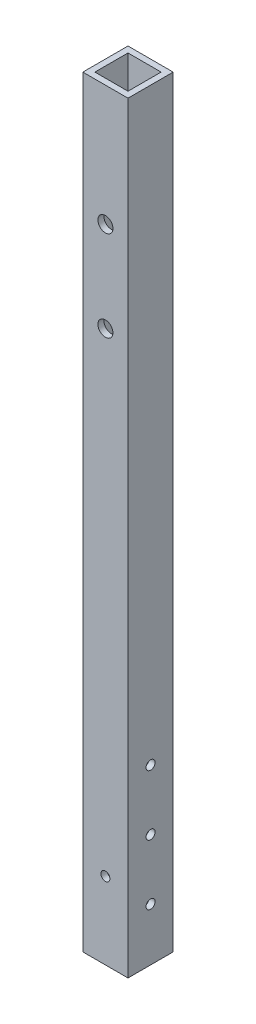
ISO-10303-21;
HEADER;
FILE_DESCRIPTION(('STEP AP214'),'2;1');
FILE_NAME('part.step','',(''),(''),'','','');
FILE_SCHEMA(('AUTOMOTIVE_DESIGN { 1 0 10303 214 1 1 1 1 }'));
ENDSEC;
DATA;
#1=APPLICATION_CONTEXT('core data for automotive mechanical design processes');
#2=APPLICATION_PROTOCOL_DEFINITION('international standard','automotive_design',2000,#1);
#3=PRODUCT_CONTEXT('',#1,'mechanical');
#4=PRODUCT('Part','Part','',(#3));
#5=PRODUCT_RELATED_PRODUCT_CATEGORY('part','',(#4));
#6=PRODUCT_DEFINITION_FORMATION('','',#4);
#7=PRODUCT_DEFINITION_CONTEXT('part definition',#1,'design');
#8=PRODUCT_DEFINITION('design','',#6,#7);
#9=PRODUCT_DEFINITION_SHAPE('','',#8);
#10=(LENGTH_UNIT() NAMED_UNIT(*) SI_UNIT(.MILLI.,.METRE.));
#11=(NAMED_UNIT(*) PLANE_ANGLE_UNIT() SI_UNIT($,.RADIAN.));
#12=(NAMED_UNIT(*) SI_UNIT($,.STERADIAN.) SOLID_ANGLE_UNIT());
#13=UNCERTAINTY_MEASURE_WITH_UNIT(LENGTH_MEASURE(1.E-05),#10,'distance_accuracy_value','');
#14=(GEOMETRIC_REPRESENTATION_CONTEXT(3) GLOBAL_UNCERTAINTY_ASSIGNED_CONTEXT((#13)) GLOBAL_UNIT_ASSIGNED_CONTEXT((#10,
#11,#12)) REPRESENTATION_CONTEXT('',''));
#15=CARTESIAN_POINT('',(0.,0.,0.));
#16=DIRECTION('',(0.,0.,1.));
#17=DIRECTION('',(1.,0.,0.));
#18=AXIS2_PLACEMENT_3D('',#15,#16,#17);
#19=CARTESIAN_POINT('',(7.5,253.,-7.5));
#20=DIRECTION('',(-1.,0.,0.));
#21=DIRECTION('',(0.,0.,1.));
#22=AXIS2_PLACEMENT_3D('',#19,#20,#21);
#23=PLANE('',#22);
#24=CARTESIAN_POINT('',(7.5,17.5,0.));
#25=DIRECTION('',(1.,0.,0.));
#26=DIRECTION('',(0.,0.,-1.));
#27=AXIS2_PLACEMENT_3D('',#24,#25,#26);
#28=CIRCLE('',#27,1.5);
#29=CARTESIAN_POINT('',(7.5,17.5,-1.5));
#30=VERTEX_POINT('',#29);
#31=EDGE_CURVE('E219',#30,#30,#28,.T.);
#32=ORIENTED_EDGE('',*,*,#31,.F.);
#33=EDGE_LOOP('',(#32));
#34=FACE_BOUND('',#33,.T.);
#35=CARTESIAN_POINT('',(7.5,37.5,0.));
#36=DIRECTION('',(1.,0.,0.));
#37=DIRECTION('',(0.,0.,-1.));
#38=AXIS2_PLACEMENT_3D('',#35,#36,#37);
#39=CIRCLE('',#38,1.5);
#40=CARTESIAN_POINT('',(7.5,37.5,-1.5));
#41=VERTEX_POINT('',#40);
#42=EDGE_CURVE('E225',#41,#41,#39,.T.);
#43=ORIENTED_EDGE('',*,*,#42,.F.);
#44=EDGE_LOOP('',(#43));
#45=FACE_BOUND('',#44,.T.);
#46=CARTESIAN_POINT('',(7.5,57.5,0.));
#47=DIRECTION('',(1.,0.,0.));
#48=DIRECTION('',(0.,0.,-1.));
#49=AXIS2_PLACEMENT_3D('',#46,#47,#48);
#50=CIRCLE('',#49,1.5);
#51=CARTESIAN_POINT('',(7.5,57.5,-1.5));
#52=VERTEX_POINT('',#51);
#53=EDGE_CURVE('E216',#52,#52,#50,.T.);
#54=ORIENTED_EDGE('',*,*,#53,.F.);
#55=EDGE_LOOP('',(#54));
#56=FACE_BOUND('',#55,.T.);
#57=DIRECTION('',(0.,0.,-1.));
#58=VECTOR('',#57,1.);
#59=CARTESIAN_POINT('',(7.5,0.,-7.5));
#60=LINE('',#59,#58);
#61=CARTESIAN_POINT('',(7.5,0.,7.5));
#62=VERTEX_POINT('',#61);
#63=CARTESIAN_POINT('',(7.5,0.,-7.5));
#64=VERTEX_POINT('',#63);
#65=EDGE_CURVE('E139',#62,#64,#60,.T.);
#66=ORIENTED_EDGE('',*,*,#65,.T.);
#67=DIRECTION('',(0.,-1.,0.));
#68=VECTOR('',#67,1.);
#69=CARTESIAN_POINT('',(7.5,253.,-7.5));
#70=LINE('',#69,#68);
#71=CARTESIAN_POINT('',(7.5,253.,-7.5));
#72=VERTEX_POINT('',#71);
#73=EDGE_CURVE('E11',#72,#64,#70,.T.);
#74=ORIENTED_EDGE('',*,*,#73,.F.);
#75=DIRECTION('',(0.,0.,-1.));
#76=VECTOR('',#75,1.);
#77=CARTESIAN_POINT('',(7.5,253.,-7.5));
#78=LINE('',#77,#76);
#79=CARTESIAN_POINT('',(7.5,253.,7.5));
#80=VERTEX_POINT('',#79);
#81=EDGE_CURVE('E143',#80,#72,#78,.T.);
#82=ORIENTED_EDGE('',*,*,#81,.F.);
#83=DIRECTION('',(0.,-1.,0.));
#84=VECTOR('',#83,1.);
#85=CARTESIAN_POINT('',(7.5,253.,7.5));
#86=LINE('',#85,#84);
#87=EDGE_CURVE('E153',#80,#62,#86,.T.);
#88=ORIENTED_EDGE('',*,*,#87,.T.);
#89=EDGE_LOOP('',(#66,#74,#82,#88));
#90=FACE_BOUND('',#89,.T.);
#91=ADVANCED_FACE('F37',(#34,#45,#56,#90),#23,.F.);
#92=CARTESIAN_POINT('',(-7.5,253.,-7.5));
#93=DIRECTION('',(0.,0.,1.));
#94=DIRECTION('',(1.,0.,0.));
#95=AXIS2_PLACEMENT_3D('',#92,#93,#94);
#96=PLANE('',#95);
#97=CARTESIAN_POINT('',(0.,213.,-7.5));
#98=DIRECTION('',(0.,0.,-1.));
#99=DIRECTION('',(-1.,0.,0.));
#100=AXIS2_PLACEMENT_3D('',#97,#98,#99);
#101=CIRCLE('',#100,2.50000000000001);
#102=CARTESIAN_POINT('',(-2.50000000000001,213.,-7.5));
#103=VERTEX_POINT('',#102);
#104=EDGE_CURVE('E193',#103,#103,#101,.T.);
#105=ORIENTED_EDGE('',*,*,#104,.F.);
#106=EDGE_LOOP('',(#105));
#107=FACE_BOUND('',#106,.T.);
#108=CARTESIAN_POINT('',(0.,183.,-7.5));
#109=DIRECTION('',(0.,0.,-1.));
#110=DIRECTION('',(-1.,0.,0.));
#111=AXIS2_PLACEMENT_3D('',#108,#109,#110);
#112=CIRCLE('',#111,2.5);
#113=CARTESIAN_POINT('',(-2.5,183.,-7.5));
#114=VERTEX_POINT('',#113);
#115=EDGE_CURVE('E203',#114,#114,#112,.T.);
#116=ORIENTED_EDGE('',*,*,#115,.F.);
#117=EDGE_LOOP('',(#116));
#118=FACE_BOUND('',#117,.T.);
#119=CARTESIAN_POINT('',(0.,25.5,-7.5));
#120=DIRECTION('',(0.,0.,-1.));
#121=DIRECTION('',(-1.,0.,0.));
#122=AXIS2_PLACEMENT_3D('',#119,#120,#121);
#123=CIRCLE('',#122,1.5);
#124=CARTESIAN_POINT('',(-1.5,25.5,-7.5));
#125=VERTEX_POINT('',#124);
#126=EDGE_CURVE('E209',#125,#125,#123,.T.);
#127=ORIENTED_EDGE('',*,*,#126,.F.);
#128=EDGE_LOOP('',(#127));
#129=FACE_BOUND('',#128,.T.);
#130=DIRECTION('',(-1.,0.,0.));
#131=VECTOR('',#130,1.);
#132=CARTESIAN_POINT('',(-7.5,0.,-7.5));
#133=LINE('',#132,#131);
#134=CARTESIAN_POINT('',(-7.5,0.,-7.5));
#135=VERTEX_POINT('',#134);
#136=EDGE_CURVE('E156',#64,#135,#133,.T.);
#137=ORIENTED_EDGE('',*,*,#136,.T.);
#138=DIRECTION('',(0.,-1.,0.));
#139=VECTOR('',#138,1.);
#140=CARTESIAN_POINT('',(-7.5,253.,-7.5));
#141=LINE('',#140,#139);
#142=CARTESIAN_POINT('',(-7.5,253.,-7.5));
#143=VERTEX_POINT('',#142);
#144=EDGE_CURVE('E45',#143,#135,#141,.T.);
#145=ORIENTED_EDGE('',*,*,#144,.F.);
#146=DIRECTION('',(-1.,0.,0.));
#147=VECTOR('',#146,1.);
#148=CARTESIAN_POINT('',(-7.5,253.,-7.5));
#149=LINE('',#148,#147);
#150=EDGE_CURVE('E146',#72,#143,#149,.T.);
#151=ORIENTED_EDGE('',*,*,#150,.F.);
#152=ORIENTED_EDGE('',*,*,#73,.T.);
#153=EDGE_LOOP('',(#137,#145,#151,#152));
#154=FACE_BOUND('',#153,.T.);
#155=ADVANCED_FACE('F260',(#107,#118,#129,#154),#96,.F.);
#156=CARTESIAN_POINT('',(-7.5,253.,-7.5));
#157=DIRECTION('',(1.,0.,0.));
#158=DIRECTION('',(0.,0.,-1.));
#159=AXIS2_PLACEMENT_3D('',#156,#157,#158);
#160=PLANE('',#159);
#161=CARTESIAN_POINT('',(-7.5,17.5,0.));
#162=DIRECTION('',(1.,0.,0.));
#163=DIRECTION('',(0.,0.,-1.));
#164=AXIS2_PLACEMENT_3D('',#161,#162,#163);
#165=CIRCLE('',#164,1.5);
#166=CARTESIAN_POINT('',(-7.5,17.5,-1.5));
#167=VERTEX_POINT('',#166);
#168=EDGE_CURVE('E172',#167,#167,#165,.T.);
#169=ORIENTED_EDGE('',*,*,#168,.T.);
#170=EDGE_LOOP('',(#169));
#171=FACE_BOUND('',#170,.T.);
#172=CARTESIAN_POINT('',(-7.5,37.5,0.));
#173=DIRECTION('',(1.,0.,0.));
#174=DIRECTION('',(0.,0.,-1.));
#175=AXIS2_PLACEMENT_3D('',#172,#173,#174);
#176=CIRCLE('',#175,1.5);
#177=CARTESIAN_POINT('',(-7.5,37.5,-1.5));
#178=VERTEX_POINT('',#177);
#179=EDGE_CURVE('E222',#178,#178,#176,.T.);
#180=ORIENTED_EDGE('',*,*,#179,.T.);
#181=EDGE_LOOP('',(#180));
#182=FACE_BOUND('',#181,.T.);
#183=CARTESIAN_POINT('',(-7.5,57.5,0.));
#184=DIRECTION('',(1.,0.,0.));
#185=DIRECTION('',(0.,0.,-1.));
#186=AXIS2_PLACEMENT_3D('',#183,#184,#185);
#187=CIRCLE('',#186,1.5);
#188=CARTESIAN_POINT('',(-7.5,57.5,-1.5));
#189=VERTEX_POINT('',#188);
#190=EDGE_CURVE('E228',#189,#189,#187,.T.);
#191=ORIENTED_EDGE('',*,*,#190,.T.);
#192=EDGE_LOOP('',(#191));
#193=FACE_BOUND('',#192,.T.);
#194=DIRECTION('',(0.,0.,1.));
#195=VECTOR('',#194,1.);
#196=CARTESIAN_POINT('',(-7.5,0.,-7.5));
#197=LINE('',#196,#195);
#198=CARTESIAN_POINT('',(-7.5,0.,7.5));
#199=VERTEX_POINT('',#198);
#200=EDGE_CURVE('E158',#135,#199,#197,.T.);
#201=ORIENTED_EDGE('',*,*,#200,.T.);
#202=DIRECTION('',(0.,-1.,0.));
#203=VECTOR('',#202,1.);
#204=CARTESIAN_POINT('',(-7.5,253.,7.5));
#205=LINE('',#204,#203);
#206=CARTESIAN_POINT('',(-7.5,253.,7.5));
#207=VERTEX_POINT('',#206);
#208=EDGE_CURVE('E163',#207,#199,#205,.T.);
#209=ORIENTED_EDGE('',*,*,#208,.F.);
#210=DIRECTION('',(0.,0.,1.));
#211=VECTOR('',#210,1.);
#212=CARTESIAN_POINT('',(-7.5,253.,-7.5));
#213=LINE('',#212,#211);
#214=EDGE_CURVE('E149',#143,#207,#213,.T.);
#215=ORIENTED_EDGE('',*,*,#214,.F.);
#216=ORIENTED_EDGE('',*,*,#144,.T.);
#217=EDGE_LOOP('',(#201,#209,#215,#216));
#218=FACE_BOUND('',#217,.T.);
#219=ADVANCED_FACE('F267',(#171,#182,#193,#218),#160,.F.);
#220=CARTESIAN_POINT('',(-7.5,253.,7.5));
#221=DIRECTION('',(0.,0.,-1.));
#222=DIRECTION('',(-1.,0.,0.));
#223=AXIS2_PLACEMENT_3D('',#220,#221,#222);
#224=PLANE('',#223);
#225=CARTESIAN_POINT('',(0.,213.,7.5));
#226=DIRECTION('',(0.,0.,-1.));
#227=DIRECTION('',(-1.,0.,0.));
#228=AXIS2_PLACEMENT_3D('',#225,#226,#227);
#229=CIRCLE('',#228,2.50000000000001);
#230=CARTESIAN_POINT('',(-2.50000000000001,213.,7.5));
#231=VERTEX_POINT('',#230);
#232=EDGE_CURVE('E187',#231,#231,#229,.T.);
#233=ORIENTED_EDGE('',*,*,#232,.T.);
#234=EDGE_LOOP('',(#233));
#235=FACE_BOUND('',#234,.T.);
#236=CARTESIAN_POINT('',(0.,183.,7.5));
#237=DIRECTION('',(0.,0.,-1.));
#238=DIRECTION('',(-1.,0.,0.));
#239=AXIS2_PLACEMENT_3D('',#236,#237,#238);
#240=CIRCLE('',#239,2.5);
#241=CARTESIAN_POINT('',(-2.5,183.,7.5));
#242=VERTEX_POINT('',#241);
#243=EDGE_CURVE('E198',#242,#242,#240,.T.);
#244=ORIENTED_EDGE('',*,*,#243,.T.);
#245=EDGE_LOOP('',(#244));
#246=FACE_BOUND('',#245,.T.);
#247=CARTESIAN_POINT('',(0.,25.5,7.5));
#248=DIRECTION('',(0.,0.,-1.));
#249=DIRECTION('',(-1.,0.,0.));
#250=AXIS2_PLACEMENT_3D('',#247,#248,#249);
#251=CIRCLE('',#250,1.5);
#252=CARTESIAN_POINT('',(-1.5,25.5,7.5));
#253=VERTEX_POINT('',#252);
#254=EDGE_CURVE('E183',#253,#253,#251,.T.);
#255=ORIENTED_EDGE('',*,*,#254,.T.);
#256=EDGE_LOOP('',(#255));
#257=FACE_BOUND('',#256,.T.);
#258=DIRECTION('',(1.,0.,0.));
#259=VECTOR('',#258,1.);
#260=CARTESIAN_POINT('',(-7.5,0.,7.5));
#261=LINE('',#260,#259);
#262=EDGE_CURVE('E147',#199,#62,#261,.T.);
#263=ORIENTED_EDGE('',*,*,#262,.T.);
#264=ORIENTED_EDGE('',*,*,#87,.F.);
#265=DIRECTION('',(1.,0.,0.));
#266=VECTOR('',#265,1.);
#267=CARTESIAN_POINT('',(-7.5,253.,7.5));
#268=LINE('',#267,#266);
#269=EDGE_CURVE('E151',#207,#80,#268,.T.);
#270=ORIENTED_EDGE('',*,*,#269,.F.);
#271=ORIENTED_EDGE('',*,*,#208,.T.);
#272=EDGE_LOOP('',(#263,#264,#270,#271));
#273=FACE_BOUND('',#272,.T.);
#274=ADVANCED_FACE('F289',(#235,#246,#257,#273),#224,.F.);
#275=CARTESIAN_POINT('',(0.,253.,0.));
#276=DIRECTION('',(0.,1.,0.));
#277=DIRECTION('',(0.,0.,1.));
#278=AXIS2_PLACEMENT_3D('',#275,#276,#277);
#279=PLANE('',#278);
#280=DIRECTION('',(0.,0.,-1.));
#281=VECTOR('',#280,1.);
#282=CARTESIAN_POINT('',(5.5,253.,-5.5));
#283=LINE('',#282,#281);
#284=CARTESIAN_POINT('',(5.5,253.,5.5));
#285=VERTEX_POINT('',#284);
#286=CARTESIAN_POINT('',(5.5,253.,-5.5));
#287=VERTEX_POINT('',#286);
#288=EDGE_CURVE('E53',#285,#287,#283,.T.);
#289=ORIENTED_EDGE('',*,*,#288,.F.);
#290=DIRECTION('',(1.,0.,0.));
#291=VECTOR('',#290,1.);
#292=CARTESIAN_POINT('',(-5.5,253.,5.5));
#293=LINE('',#292,#291);
#294=CARTESIAN_POINT('',(-5.5,253.,5.5));
#295=VERTEX_POINT('',#294);
#296=EDGE_CURVE('E121',#295,#285,#293,.T.);
#297=ORIENTED_EDGE('',*,*,#296,.F.);
#298=DIRECTION('',(0.,0.,1.));
#299=VECTOR('',#298,1.);
#300=CARTESIAN_POINT('',(-5.5,253.,-5.5));
#301=LINE('',#300,#299);
#302=CARTESIAN_POINT('',(-5.5,253.,-5.5));
#303=VERTEX_POINT('',#302);
#304=EDGE_CURVE('E124',#303,#295,#301,.T.);
#305=ORIENTED_EDGE('',*,*,#304,.F.);
#306=DIRECTION('',(-1.,0.,0.));
#307=VECTOR('',#306,1.);
#308=CARTESIAN_POINT('',(-5.5,253.,-5.5));
#309=LINE('',#308,#307);
#310=EDGE_CURVE('E133',#287,#303,#309,.T.);
#311=ORIENTED_EDGE('',*,*,#310,.F.);
#312=EDGE_LOOP('',(#289,#297,#305,#311));
#313=FACE_BOUND('',#312,.T.);
#314=ORIENTED_EDGE('',*,*,#81,.T.);
#315=ORIENTED_EDGE('',*,*,#150,.T.);
#316=ORIENTED_EDGE('',*,*,#214,.T.);
#317=ORIENTED_EDGE('',*,*,#269,.T.);
#318=EDGE_LOOP('',(#314,#315,#316,#317));
#319=FACE_BOUND('',#318,.T.);
#320=ADVANCED_FACE('F285',(#313,#319),#279,.T.);
#321=CARTESIAN_POINT('',(0.,0.,0.));
#322=DIRECTION('',(0.,1.,0.));
#323=DIRECTION('',(0.,0.,1.));
#324=AXIS2_PLACEMENT_3D('',#321,#322,#323);
#325=PLANE('',#324);
#326=DIRECTION('',(1.,0.,0.));
#327=VECTOR('',#326,1.);
#328=CARTESIAN_POINT('',(-5.5,0.,5.5));
#329=LINE('',#328,#327);
#330=CARTESIAN_POINT('',(-5.5,0.,5.5));
#331=VERTEX_POINT('',#330);
#332=CARTESIAN_POINT('',(5.5,0.,5.5));
#333=VERTEX_POINT('',#332);
#334=EDGE_CURVE('E111',#331,#333,#329,.T.);
#335=ORIENTED_EDGE('',*,*,#334,.T.);
#336=DIRECTION('',(0.,0.,-1.));
#337=VECTOR('',#336,1.);
#338=CARTESIAN_POINT('',(5.5,0.,-5.5));
#339=LINE('',#338,#337);
#340=CARTESIAN_POINT('',(5.5,0.,-5.5));
#341=VERTEX_POINT('',#340);
#342=EDGE_CURVE('E105',#333,#341,#339,.T.);
#343=ORIENTED_EDGE('',*,*,#342,.T.);
#344=DIRECTION('',(-1.,0.,0.));
#345=VECTOR('',#344,1.);
#346=CARTESIAN_POINT('',(-5.5,0.,-5.5));
#347=LINE('',#346,#345);
#348=CARTESIAN_POINT('',(-5.5,0.,-5.5));
#349=VERTEX_POINT('',#348);
#350=EDGE_CURVE('E114',#341,#349,#347,.T.);
#351=ORIENTED_EDGE('',*,*,#350,.T.);
#352=DIRECTION('',(0.,0.,1.));
#353=VECTOR('',#352,1.);
#354=CARTESIAN_POINT('',(-5.5,0.,-5.5));
#355=LINE('',#354,#353);
#356=EDGE_CURVE('E61',#349,#331,#355,.T.);
#357=ORIENTED_EDGE('',*,*,#356,.T.);
#358=EDGE_LOOP('',(#335,#343,#351,#357));
#359=FACE_BOUND('',#358,.T.);
#360=ORIENTED_EDGE('',*,*,#65,.F.);
#361=ORIENTED_EDGE('',*,*,#262,.F.);
#362=ORIENTED_EDGE('',*,*,#200,.F.);
#363=ORIENTED_EDGE('',*,*,#136,.F.);
#364=EDGE_LOOP('',(#360,#361,#362,#363));
#365=FACE_BOUND('',#364,.T.);
#366=ADVANCED_FACE('F118',(#359,#365),#325,.F.);
#367=CARTESIAN_POINT('',(5.5,0.,-5.5));
#368=DIRECTION('',(1.,0.,0.));
#369=DIRECTION('',(0.,0.,-1.));
#370=AXIS2_PLACEMENT_3D('',#367,#368,#369);
#371=PLANE('',#370);
#372=CARTESIAN_POINT('',(5.5,17.5,0.));
#373=DIRECTION('',(1.,0.,0.));
#374=DIRECTION('',(0.,0.,-1.));
#375=AXIS2_PLACEMENT_3D('',#372,#373,#374);
#376=CIRCLE('',#375,1.5);
#377=CARTESIAN_POINT('',(5.5,17.5,-1.5));
#378=VERTEX_POINT('',#377);
#379=EDGE_CURVE('E127',#378,#378,#376,.T.);
#380=ORIENTED_EDGE('',*,*,#379,.T.);
#381=EDGE_LOOP('',(#380));
#382=FACE_BOUND('',#381,.T.);
#383=CARTESIAN_POINT('',(5.5,37.5,0.));
#384=DIRECTION('',(1.,0.,0.));
#385=DIRECTION('',(0.,0.,-1.));
#386=AXIS2_PLACEMENT_3D('',#383,#384,#385);
#387=CIRCLE('',#386,1.5);
#388=CARTESIAN_POINT('',(5.5,37.5,-1.5));
#389=VERTEX_POINT('',#388);
#390=EDGE_CURVE('E176',#389,#389,#387,.T.);
#391=ORIENTED_EDGE('',*,*,#390,.T.);
#392=EDGE_LOOP('',(#391));
#393=FACE_BOUND('',#392,.T.);
#394=CARTESIAN_POINT('',(5.5,57.5,0.));
#395=DIRECTION('',(1.,0.,0.));
#396=DIRECTION('',(0.,0.,-1.));
#397=AXIS2_PLACEMENT_3D('',#394,#395,#396);
#398=CIRCLE('',#397,1.5);
#399=CARTESIAN_POINT('',(5.5,57.5,-1.5));
#400=VERTEX_POINT('',#399);
#401=EDGE_CURVE('E171',#400,#400,#398,.T.);
#402=ORIENTED_EDGE('',*,*,#401,.T.);
#403=EDGE_LOOP('',(#402));
#404=FACE_BOUND('',#403,.T.);
#405=ORIENTED_EDGE('',*,*,#288,.T.);
#406=DIRECTION('',(0.,1.,0.));
#407=VECTOR('',#406,1.);
#408=CARTESIAN_POINT('',(5.5,0.,-5.5));
#409=LINE('',#408,#407);
#410=EDGE_CURVE('E101',#341,#287,#409,.T.);
#411=ORIENTED_EDGE('',*,*,#410,.F.);
#412=ORIENTED_EDGE('',*,*,#342,.F.);
#413=DIRECTION('',(0.,1.,0.));
#414=VECTOR('',#413,1.);
#415=CARTESIAN_POINT('',(5.5,0.,5.5));
#416=LINE('',#415,#414);
#417=EDGE_CURVE('E137',#333,#285,#416,.T.);
#418=ORIENTED_EDGE('',*,*,#417,.T.);
#419=EDGE_LOOP('',(#405,#411,#412,#418));
#420=FACE_BOUND('',#419,.T.);
#421=ADVANCED_FACE('F103',(#382,#393,#404,#420),#371,.F.);
#422=CARTESIAN_POINT('',(-5.5,0.,5.5));
#423=DIRECTION('',(0.,0.,1.));
#424=DIRECTION('',(1.,0.,0.));
#425=AXIS2_PLACEMENT_3D('',#422,#423,#424);
#426=PLANE('',#425);
#427=CARTESIAN_POINT('',(0.,213.,5.5));
#428=DIRECTION('',(0.,0.,1.));
#429=DIRECTION('',(1.,0.,0.));
#430=AXIS2_PLACEMENT_3D('',#427,#428,#429);
#431=CIRCLE('',#430,2.50000000000001);
#432=CARTESIAN_POINT('',(2.50000000000001,213.,5.5));
#433=VERTEX_POINT('',#432);
#434=EDGE_CURVE('E206',#433,#433,#431,.T.);
#435=ORIENTED_EDGE('',*,*,#434,.T.);
#436=EDGE_LOOP('',(#435));
#437=FACE_BOUND('',#436,.T.);
#438=CARTESIAN_POINT('',(0.,183.,5.5));
#439=DIRECTION('',(0.,0.,1.));
#440=DIRECTION('',(1.,0.,0.));
#441=AXIS2_PLACEMENT_3D('',#438,#439,#440);
#442=CIRCLE('',#441,2.5);
#443=CARTESIAN_POINT('',(2.5,183.,5.5));
#444=VERTEX_POINT('',#443);
#445=EDGE_CURVE('E186',#444,#444,#442,.T.);
#446=ORIENTED_EDGE('',*,*,#445,.T.);
#447=EDGE_LOOP('',(#446));
#448=FACE_BOUND('',#447,.T.);
#449=CARTESIAN_POINT('',(0.,25.5,5.5));
#450=DIRECTION('',(0.,0.,1.));
#451=DIRECTION('',(1.,0.,0.));
#452=AXIS2_PLACEMENT_3D('',#449,#450,#451);
#453=CIRCLE('',#452,1.5);
#454=CARTESIAN_POINT('',(1.5,25.5,5.5));
#455=VERTEX_POINT('',#454);
#456=EDGE_CURVE('E182',#455,#455,#453,.T.);
#457=ORIENTED_EDGE('',*,*,#456,.T.);
#458=EDGE_LOOP('',(#457));
#459=FACE_BOUND('',#458,.T.);
#460=ORIENTED_EDGE('',*,*,#296,.T.);
#461=ORIENTED_EDGE('',*,*,#417,.F.);
#462=ORIENTED_EDGE('',*,*,#334,.F.);
#463=DIRECTION('',(0.,1.,0.));
#464=VECTOR('',#463,1.);
#465=CARTESIAN_POINT('',(-5.5,0.,5.5));
#466=LINE('',#465,#464);
#467=EDGE_CURVE('E140',#331,#295,#466,.T.);
#468=ORIENTED_EDGE('',*,*,#467,.T.);
#469=EDGE_LOOP('',(#460,#461,#462,#468));
#470=FACE_BOUND('',#469,.T.);
#471=ADVANCED_FACE('F305',(#437,#448,#459,#470),#426,.F.);
#472=CARTESIAN_POINT('',(-5.5,0.,-5.5));
#473=DIRECTION('',(-1.,0.,0.));
#474=DIRECTION('',(0.,0.,1.));
#475=AXIS2_PLACEMENT_3D('',#472,#473,#474);
#476=PLANE('',#475);
#477=CARTESIAN_POINT('',(-5.5,17.5,0.));
#478=DIRECTION('',(-1.,0.,0.));
#479=DIRECTION('',(0.,0.,1.));
#480=AXIS2_PLACEMENT_3D('',#477,#478,#479);
#481=CIRCLE('',#480,1.5);
#482=CARTESIAN_POINT('',(-5.5,17.5,1.5));
#483=VERTEX_POINT('',#482);
#484=EDGE_CURVE('E177',#483,#483,#481,.T.);
#485=ORIENTED_EDGE('',*,*,#484,.T.);
#486=EDGE_LOOP('',(#485));
#487=FACE_BOUND('',#486,.T.);
#488=CARTESIAN_POINT('',(-5.5,37.5,0.));
#489=DIRECTION('',(-1.,0.,0.));
#490=DIRECTION('',(0.,0.,1.));
#491=AXIS2_PLACEMENT_3D('',#488,#489,#490);
#492=CIRCLE('',#491,1.5);
#493=CARTESIAN_POINT('',(-5.5,37.5,1.5));
#494=VERTEX_POINT('',#493);
#495=EDGE_CURVE('E173',#494,#494,#492,.T.);
#496=ORIENTED_EDGE('',*,*,#495,.T.);
#497=EDGE_LOOP('',(#496));
#498=FACE_BOUND('',#497,.T.);
#499=CARTESIAN_POINT('',(-5.5,57.5,0.));
#500=DIRECTION('',(-1.,0.,0.));
#501=DIRECTION('',(0.,0.,1.));
#502=AXIS2_PLACEMENT_3D('',#499,#500,#501);
#503=CIRCLE('',#502,1.5);
#504=CARTESIAN_POINT('',(-5.5,57.5,1.5));
#505=VERTEX_POINT('',#504);
#506=EDGE_CURVE('E168',#505,#505,#503,.T.);
#507=ORIENTED_EDGE('',*,*,#506,.T.);
#508=EDGE_LOOP('',(#507));
#509=FACE_BOUND('',#508,.T.);
#510=ORIENTED_EDGE('',*,*,#304,.T.);
#511=ORIENTED_EDGE('',*,*,#467,.F.);
#512=ORIENTED_EDGE('',*,*,#356,.F.);
#513=DIRECTION('',(0.,1.,0.));
#514=VECTOR('',#513,1.);
#515=CARTESIAN_POINT('',(-5.5,0.,-5.5));
#516=LINE('',#515,#514);
#517=EDGE_CURVE('E110',#349,#303,#516,.T.);
#518=ORIENTED_EDGE('',*,*,#517,.T.);
#519=EDGE_LOOP('',(#510,#511,#512,#518));
#520=FACE_BOUND('',#519,.T.);
#521=ADVANCED_FACE('F309',(#487,#498,#509,#520),#476,.F.);
#522=CARTESIAN_POINT('',(-5.5,0.,-5.5));
#523=DIRECTION('',(0.,0.,-1.));
#524=DIRECTION('',(-1.,0.,0.));
#525=AXIS2_PLACEMENT_3D('',#522,#523,#524);
#526=PLANE('',#525);
#527=CARTESIAN_POINT('',(0.,213.,-5.5));
#528=DIRECTION('',(0.,0.,-1.));
#529=DIRECTION('',(-1.,0.,0.));
#530=AXIS2_PLACEMENT_3D('',#527,#528,#529);
#531=CIRCLE('',#530,2.50000000000001);
#532=CARTESIAN_POINT('',(-2.50000000000001,213.,-5.5));
#533=VERTEX_POINT('',#532);
#534=EDGE_CURVE('E40',#533,#533,#531,.T.);
#535=ORIENTED_EDGE('',*,*,#534,.T.);
#536=EDGE_LOOP('',(#535));
#537=FACE_BOUND('',#536,.T.);
#538=CARTESIAN_POINT('',(0.,183.,-5.5));
#539=DIRECTION('',(0.,0.,-1.));
#540=DIRECTION('',(-1.,0.,0.));
#541=AXIS2_PLACEMENT_3D('',#538,#539,#540);
#542=CIRCLE('',#541,2.5);
#543=CARTESIAN_POINT('',(-2.5,183.,-5.5));
#544=VERTEX_POINT('',#543);
#545=EDGE_CURVE('E184',#544,#544,#542,.T.);
#546=ORIENTED_EDGE('',*,*,#545,.T.);
#547=EDGE_LOOP('',(#546));
#548=FACE_BOUND('',#547,.T.);
#549=CARTESIAN_POINT('',(0.,25.5,-5.5));
#550=DIRECTION('',(0.,0.,-1.));
#551=DIRECTION('',(-1.,0.,0.));
#552=AXIS2_PLACEMENT_3D('',#549,#550,#551);
#553=CIRCLE('',#552,1.5);
#554=CARTESIAN_POINT('',(-1.5,25.5,-5.5));
#555=VERTEX_POINT('',#554);
#556=EDGE_CURVE('E180',#555,#555,#553,.T.);
#557=ORIENTED_EDGE('',*,*,#556,.T.);
#558=EDGE_LOOP('',(#557));
#559=FACE_BOUND('',#558,.T.);
#560=ORIENTED_EDGE('',*,*,#310,.T.);
#561=ORIENTED_EDGE('',*,*,#517,.F.);
#562=ORIENTED_EDGE('',*,*,#350,.F.);
#563=ORIENTED_EDGE('',*,*,#410,.T.);
#564=EDGE_LOOP('',(#560,#561,#562,#563));
#565=FACE_BOUND('',#564,.T.);
#566=ADVANCED_FACE('F115',(#537,#548,#559,#565),#526,.F.);
#567=CARTESIAN_POINT('',(-7.5,57.5,0.));
#568=DIRECTION('',(1.,0.,0.));
#569=DIRECTION('',(0.,0.,-1.));
#570=AXIS2_PLACEMENT_3D('',#567,#568,#569);
#571=CYLINDRICAL_SURFACE('',#570,1.5);
#572=ORIENTED_EDGE('',*,*,#190,.F.);
#573=EDGE_LOOP('',(#572));
#574=FACE_BOUND('',#573,.T.);
#575=ORIENTED_EDGE('',*,*,#506,.F.);
#576=EDGE_LOOP('',(#575));
#577=FACE_BOUND('',#576,.T.);
#578=ADVANCED_FACE('F256',(#574,#577),#571,.F.);
#579=CARTESIAN_POINT('',(-7.5,37.5,0.));
#580=DIRECTION('',(1.,0.,0.));
#581=DIRECTION('',(0.,0.,-1.));
#582=AXIS2_PLACEMENT_3D('',#579,#580,#581);
#583=CYLINDRICAL_SURFACE('',#582,1.5);
#584=ORIENTED_EDGE('',*,*,#179,.F.);
#585=EDGE_LOOP('',(#584));
#586=FACE_BOUND('',#585,.T.);
#587=ORIENTED_EDGE('',*,*,#495,.F.);
#588=EDGE_LOOP('',(#587));
#589=FACE_BOUND('',#588,.T.);
#590=ADVANCED_FACE('F245',(#586,#589),#583,.F.);
#591=CARTESIAN_POINT('',(-7.5,17.5,0.));
#592=DIRECTION('',(1.,0.,0.));
#593=DIRECTION('',(0.,0.,-1.));
#594=AXIS2_PLACEMENT_3D('',#591,#592,#593);
#595=CYLINDRICAL_SURFACE('',#594,1.5);
#596=ORIENTED_EDGE('',*,*,#168,.F.);
#597=EDGE_LOOP('',(#596));
#598=FACE_BOUND('',#597,.T.);
#599=ORIENTED_EDGE('',*,*,#484,.F.);
#600=EDGE_LOOP('',(#599));
#601=FACE_BOUND('',#600,.T.);
#602=ADVANCED_FACE('F253',(#598,#601),#595,.F.);
#603=ORIENTED_EDGE('',*,*,#53,.T.);
#604=EDGE_LOOP('',(#603));
#605=FACE_BOUND('',#604,.T.);
#606=ORIENTED_EDGE('',*,*,#401,.F.);
#607=EDGE_LOOP('',(#606));
#608=FACE_BOUND('',#607,.T.);
#609=ADVANCED_FACE('F242',(#605,#608),#571,.F.);
#610=ORIENTED_EDGE('',*,*,#42,.T.);
#611=EDGE_LOOP('',(#610));
#612=FACE_BOUND('',#611,.T.);
#613=ORIENTED_EDGE('',*,*,#390,.F.);
#614=EDGE_LOOP('',(#613));
#615=FACE_BOUND('',#614,.T.);
#616=ADVANCED_FACE('F239',(#612,#615),#583,.F.);
#617=ORIENTED_EDGE('',*,*,#31,.T.);
#618=EDGE_LOOP('',(#617));
#619=FACE_BOUND('',#618,.T.);
#620=ORIENTED_EDGE('',*,*,#379,.F.);
#621=EDGE_LOOP('',(#620));
#622=FACE_BOUND('',#621,.T.);
#623=ADVANCED_FACE('F241',(#619,#622),#595,.F.);
#624=CARTESIAN_POINT('',(0.,25.5,7.5));
#625=DIRECTION('',(0.,0.,-1.));
#626=DIRECTION('',(-1.,0.,0.));
#627=AXIS2_PLACEMENT_3D('',#624,#625,#626);
#628=CYLINDRICAL_SURFACE('',#627,1.5);
#629=ORIENTED_EDGE('',*,*,#126,.T.);
#630=EDGE_LOOP('',(#629));
#631=FACE_BOUND('',#630,.T.);
#632=ORIENTED_EDGE('',*,*,#556,.F.);
#633=EDGE_LOOP('',(#632));
#634=FACE_BOUND('',#633,.T.);
#635=ADVANCED_FACE('F250',(#631,#634),#628,.F.);
#636=ORIENTED_EDGE('',*,*,#254,.F.);
#637=EDGE_LOOP('',(#636));
#638=FACE_BOUND('',#637,.T.);
#639=ORIENTED_EDGE('',*,*,#456,.F.);
#640=EDGE_LOOP('',(#639));
#641=FACE_BOUND('',#640,.T.);
#642=ADVANCED_FACE('F327',(#638,#641),#628,.F.);
#643=CARTESIAN_POINT('',(0.,183.,7.5));
#644=DIRECTION('',(0.,0.,-1.));
#645=DIRECTION('',(-1.,0.,0.));
#646=AXIS2_PLACEMENT_3D('',#643,#644,#645);
#647=CYLINDRICAL_SURFACE('',#646,2.5);
#648=ORIENTED_EDGE('',*,*,#115,.T.);
#649=EDGE_LOOP('',(#648));
#650=FACE_BOUND('',#649,.T.);
#651=ORIENTED_EDGE('',*,*,#545,.F.);
#652=EDGE_LOOP('',(#651));
#653=FACE_BOUND('',#652,.T.);
#654=ADVANCED_FACE('F329',(#650,#653),#647,.F.);
#655=CARTESIAN_POINT('',(0.,213.,7.5));
#656=DIRECTION('',(0.,0.,-1.));
#657=DIRECTION('',(-1.,0.,0.));
#658=AXIS2_PLACEMENT_3D('',#655,#656,#657);
#659=CYLINDRICAL_SURFACE('',#658,2.50000000000001);
#660=ORIENTED_EDGE('',*,*,#104,.T.);
#661=EDGE_LOOP('',(#660));
#662=FACE_BOUND('',#661,.T.);
#663=ORIENTED_EDGE('',*,*,#534,.F.);
#664=EDGE_LOOP('',(#663));
#665=FACE_BOUND('',#664,.T.);
#666=ADVANCED_FACE('F336',(#662,#665),#659,.F.);
#667=ORIENTED_EDGE('',*,*,#243,.F.);
#668=EDGE_LOOP('',(#667));
#669=FACE_BOUND('',#668,.T.);
#670=ORIENTED_EDGE('',*,*,#445,.F.);
#671=EDGE_LOOP('',(#670));
#672=FACE_BOUND('',#671,.T.);
#673=ADVANCED_FACE('F339',(#669,#672),#647,.F.);
#674=ORIENTED_EDGE('',*,*,#232,.F.);
#675=EDGE_LOOP('',(#674));
#676=FACE_BOUND('',#675,.T.);
#677=ORIENTED_EDGE('',*,*,#434,.F.);
#678=EDGE_LOOP('',(#677));
#679=FACE_BOUND('',#678,.T.);
#680=ADVANCED_FACE('F344',(#676,#679),#659,.F.);
#681=CLOSED_SHELL('',(#91,#155,#219,#274,#320,#366,#421,#471,#521,#566,#578,#590,#602,#609,#616,
#623,#635,#642,#654,#666,#673,#680));
#682=MANIFOLD_SOLID_BREP('B2',#681);
#683=ADVANCED_BREP_SHAPE_REPRESENTATION('',(#18,#682),#14);
#684=SHAPE_DEFINITION_REPRESENTATION(#9,#683);
ENDSEC;
END-ISO-10303-21;
